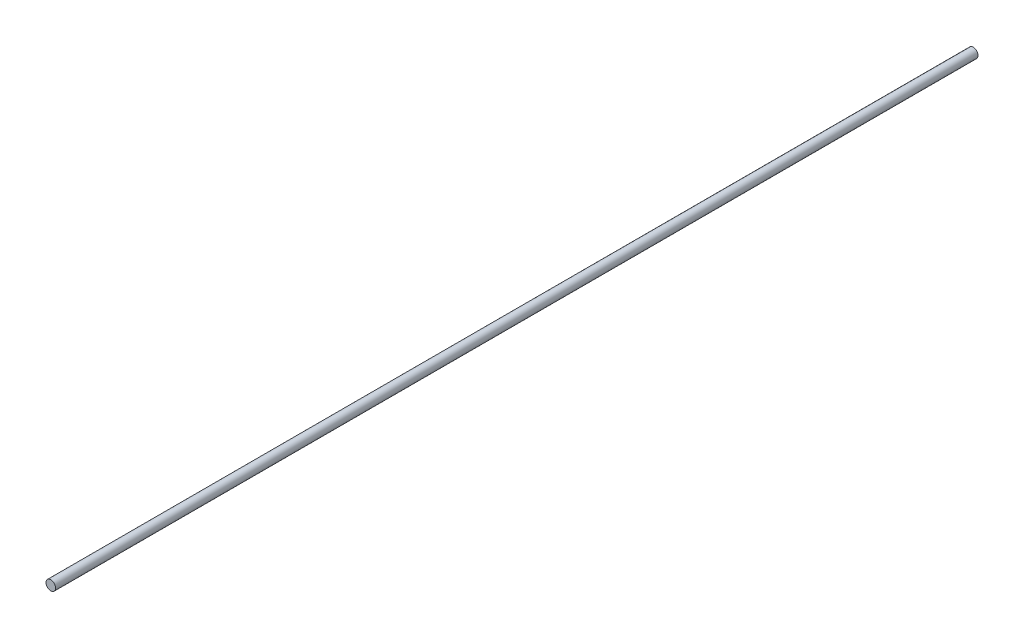
ISO-10303-21;
HEADER;
FILE_DESCRIPTION(('STEP AP214'),'2;1');
FILE_NAME('part.step','',(''),(''),'','','');
FILE_SCHEMA(('AUTOMOTIVE_DESIGN { 1 0 10303 214 1 1 1 1 }'));
ENDSEC;
DATA;
#1=APPLICATION_CONTEXT('core data for automotive mechanical design processes');
#2=APPLICATION_PROTOCOL_DEFINITION('international standard','automotive_design',2000,#1);
#3=PRODUCT_CONTEXT('',#1,'mechanical');
#4=PRODUCT('Part','Part','',(#3));
#5=PRODUCT_RELATED_PRODUCT_CATEGORY('part','',(#4));
#6=PRODUCT_DEFINITION_FORMATION('','',#4);
#7=PRODUCT_DEFINITION_CONTEXT('part definition',#1,'design');
#8=PRODUCT_DEFINITION('design','',#6,#7);
#9=PRODUCT_DEFINITION_SHAPE('','',#8);
#10=(LENGTH_UNIT() NAMED_UNIT(*) SI_UNIT(.MILLI.,.METRE.));
#11=(NAMED_UNIT(*) PLANE_ANGLE_UNIT() SI_UNIT($,.RADIAN.));
#12=(NAMED_UNIT(*) SI_UNIT($,.STERADIAN.) SOLID_ANGLE_UNIT());
#13=UNCERTAINTY_MEASURE_WITH_UNIT(LENGTH_MEASURE(1.E-05),#10,'distance_accuracy_value','');
#14=(GEOMETRIC_REPRESENTATION_CONTEXT(3) GLOBAL_UNCERTAINTY_ASSIGNED_CONTEXT((#13)) GLOBAL_UNIT_ASSIGNED_CONTEXT((#10,
#11,#12)) REPRESENTATION_CONTEXT('',''));
#15=CARTESIAN_POINT('',(0.,0.,0.));
#16=DIRECTION('',(0.,0.,1.));
#17=DIRECTION('',(1.,0.,0.));
#18=AXIS2_PLACEMENT_3D('',#15,#16,#17);
#19=CARTESIAN_POINT('',(0.,0.,457.2));
#20=DIRECTION('',(0.,0.,-1.));
#21=DIRECTION('',(-1.,0.,0.));
#22=AXIS2_PLACEMENT_3D('',#19,#20,#21);
#23=CYLINDRICAL_SURFACE('',#22,4.7625);
#24=CARTESIAN_POINT('',(0.,0.,457.2));
#25=DIRECTION('',(0.,0.,1.));
#26=DIRECTION('',(1.,0.,0.));
#27=AXIS2_PLACEMENT_3D('',#24,#25,#26);
#28=CIRCLE('',#27,4.7625);
#29=CARTESIAN_POINT('',(-4.7625,0.,457.2));
#30=VERTEX_POINT('',#29);
#31=EDGE_CURVE('E10',#30,#30,#28,.T.);
#32=CARTESIAN_POINT('',(0.,0.,-457.2));
#33=DIRECTION('',(0.,0.,1.));
#34=DIRECTION('',(1.,0.,0.));
#35=AXIS2_PLACEMENT_3D('',#32,#33,#34);
#36=CIRCLE('',#35,4.7625);
#37=CARTESIAN_POINT('',(-4.7625,0.,-457.2));
#38=VERTEX_POINT('',#37);
#39=EDGE_CURVE('E38',#38,#38,#36,.T.);
#40=CARTESIAN_POINT('',(-4.7625,0.,457.2));
#41=CARTESIAN_POINT('',(-4.7625,0.,447.675));
#42=CARTESIAN_POINT('',(-4.7625,0.,438.15));
#43=CARTESIAN_POINT('',(-4.7625,0.,419.1));
#44=CARTESIAN_POINT('',(-4.7625,0.,409.575));
#45=CARTESIAN_POINT('',(-4.7625,0.,390.525));
#46=CARTESIAN_POINT('',(-4.7625,0.,381.));
#47=CARTESIAN_POINT('',(-4.7625,0.,361.95));
#48=CARTESIAN_POINT('',(-4.7625,0.,352.425));
#49=CARTESIAN_POINT('',(-4.7625,0.,333.375));
#50=CARTESIAN_POINT('',(-4.7625,0.,323.85));
#51=CARTESIAN_POINT('',(-4.7625,0.,304.8));
#52=CARTESIAN_POINT('',(-4.7625,0.,295.275));
#53=CARTESIAN_POINT('',(-4.7625,0.,276.225));
#54=CARTESIAN_POINT('',(-4.7625,0.,266.7));
#55=CARTESIAN_POINT('',(-4.7625,0.,247.65));
#56=CARTESIAN_POINT('',(-4.7625,0.,238.125));
#57=CARTESIAN_POINT('',(-4.7625,0.,219.075));
#58=CARTESIAN_POINT('',(-4.7625,0.,209.55));
#59=CARTESIAN_POINT('',(-4.7625,0.,190.5));
#60=CARTESIAN_POINT('',(-4.7625,0.,180.975));
#61=CARTESIAN_POINT('',(-4.7625,0.,161.925));
#62=CARTESIAN_POINT('',(-4.7625,0.,152.4));
#63=CARTESIAN_POINT('',(-4.7625,0.,133.35));
#64=CARTESIAN_POINT('',(-4.7625,0.,123.825));
#65=CARTESIAN_POINT('',(-4.7625,0.,104.775));
#66=CARTESIAN_POINT('',(-4.7625,0.,95.2499999999999));
#67=CARTESIAN_POINT('',(-4.7625,0.,76.1999999999999));
#68=CARTESIAN_POINT('',(-4.7625,0.,66.6749999999999));
#69=CARTESIAN_POINT('',(-4.7625,0.,47.6249999999999));
#70=CARTESIAN_POINT('',(-4.7625,0.,38.0999999999999));
#71=CARTESIAN_POINT('',(-4.7625,0.,19.0499999999999));
#72=CARTESIAN_POINT('',(-4.7625,0.,9.5249999999999));
#73=CARTESIAN_POINT('',(-4.7625,0.,-9.52500000000012));
#74=CARTESIAN_POINT('',(-4.7625,0.,-19.0500000000001));
#75=CARTESIAN_POINT('',(-4.7625,0.,-38.1000000000001));
#76=CARTESIAN_POINT('',(-4.7625,0.,-47.6250000000001));
#77=CARTESIAN_POINT('',(-4.7625,0.,-66.675));
#78=CARTESIAN_POINT('',(-4.7625,0.,-76.2));
#79=CARTESIAN_POINT('',(-4.7625,0.,-95.2500000000001));
#80=CARTESIAN_POINT('',(-4.7625,0.,-104.775));
#81=CARTESIAN_POINT('',(-4.7625,0.,-123.825));
#82=CARTESIAN_POINT('',(-4.7625,0.,-133.35));
#83=CARTESIAN_POINT('',(-4.7625,0.,-152.4));
#84=CARTESIAN_POINT('',(-4.7625,0.,-161.925));
#85=CARTESIAN_POINT('',(-4.7625,0.,-180.975));
#86=CARTESIAN_POINT('',(-4.7625,0.,-190.5));
#87=CARTESIAN_POINT('',(-4.7625,0.,-209.55));
#88=CARTESIAN_POINT('',(-4.7625,0.,-219.075));
#89=CARTESIAN_POINT('',(-4.7625,0.,-238.125));
#90=CARTESIAN_POINT('',(-4.7625,0.,-247.65));
#91=CARTESIAN_POINT('',(-4.7625,0.,-266.7));
#92=CARTESIAN_POINT('',(-4.7625,0.,-276.225));
#93=CARTESIAN_POINT('',(-4.7625,0.,-295.275));
#94=CARTESIAN_POINT('',(-4.7625,0.,-304.8));
#95=CARTESIAN_POINT('',(-4.7625,0.,-323.85));
#96=CARTESIAN_POINT('',(-4.7625,0.,-333.375));
#97=CARTESIAN_POINT('',(-4.7625,0.,-352.425));
#98=CARTESIAN_POINT('',(-4.7625,0.,-361.95));
#99=CARTESIAN_POINT('',(-4.7625,0.,-381.));
#100=CARTESIAN_POINT('',(-4.7625,0.,-390.525));
#101=CARTESIAN_POINT('',(-4.7625,0.,-409.575));
#102=CARTESIAN_POINT('',(-4.7625,0.,-419.1));
#103=CARTESIAN_POINT('',(-4.7625,0.,-438.15));
#104=CARTESIAN_POINT('',(-4.7625,0.,-447.675));
#105=CARTESIAN_POINT('',(-4.7625,0.,-457.2));
#106=B_SPLINE_CURVE_WITH_KNOTS('',3,(#40,#41,#42,#43,#44,#45,#46,#47,#48,#49,#50,#51,#52,#53,
#54,#55,#56,#57,#58,#59,#60,#61,#62,#63,#64,#65,#66,#67,#68,#69,#70,#71,#72,#73,#74,#75,#76,#77,
#78,#79,#80,#81,#82,#83,#84,#85,#86,#87,#88,#89,#90,#91,#92,#93,#94,#95,#96,#97,#98,#99,#100,
#101,#102,#103,#104,#105),.UNSPECIFIED.,.F.,.F.,(4,2,2,2,2,2,2,2,2,2,2,2,2,2,2,2,2,2,2,2,2,2,2,
2,2,2,2,2,2,2,2,2,4),(0.,28.575,57.15,85.725,114.3,142.875,171.45,200.025,228.6,257.175,285.75,
314.325,342.9,371.475,400.05,428.625,457.2,485.775,514.35,542.925,571.5,600.075,628.65,657.225,
685.8,714.375,742.95,771.525,800.1,828.675,857.25,885.825,914.4),.UNSPECIFIED.);
#107=EDGE_CURVE('BSEAM32',#30,#38,#106,.T.);
#108=ORIENTED_EDGE('',*,*,#31,.F.);
#109=ORIENTED_EDGE('',*,*,#39,.T.);
#110=ORIENTED_EDGE('',*,*,#107,.T.);
#111=ORIENTED_EDGE('',*,*,#107,.F.);
#112=EDGE_LOOP('',(#108,#110,#109,#111));
#113=FACE_BOUND('',#112,.T.);
#114=ADVANCED_FACE('F32',(#113),#23,.T.);
#115=CARTESIAN_POINT('',(0.,0.,457.2));
#116=DIRECTION('',(0.,0.,1.));
#117=DIRECTION('',(1.,0.,0.));
#118=AXIS2_PLACEMENT_3D('',#115,#116,#117);
#119=PLANE('',#118);
#120=ORIENTED_EDGE('',*,*,#31,.T.);
#121=EDGE_LOOP('',(#120));
#122=FACE_BOUND('',#121,.T.);
#123=ADVANCED_FACE('F47',(#122),#119,.T.);
#124=CARTESIAN_POINT('',(0.,0.,-457.2));
#125=DIRECTION('',(0.,0.,1.));
#126=DIRECTION('',(1.,0.,0.));
#127=AXIS2_PLACEMENT_3D('',#124,#125,#126);
#128=PLANE('',#127);
#129=ORIENTED_EDGE('',*,*,#39,.F.);
#130=EDGE_LOOP('',(#129));
#131=FACE_BOUND('',#130,.T.);
#132=ADVANCED_FACE('F45',(#131),#128,.F.);
#133=CLOSED_SHELL('',(#114,#123,#132));
#134=MANIFOLD_SOLID_BREP('B2',#133);
#135=ADVANCED_BREP_SHAPE_REPRESENTATION('',(#18,#134),#14);
#136=SHAPE_DEFINITION_REPRESENTATION(#9,#135);
ENDSEC;
END-ISO-10303-21;
